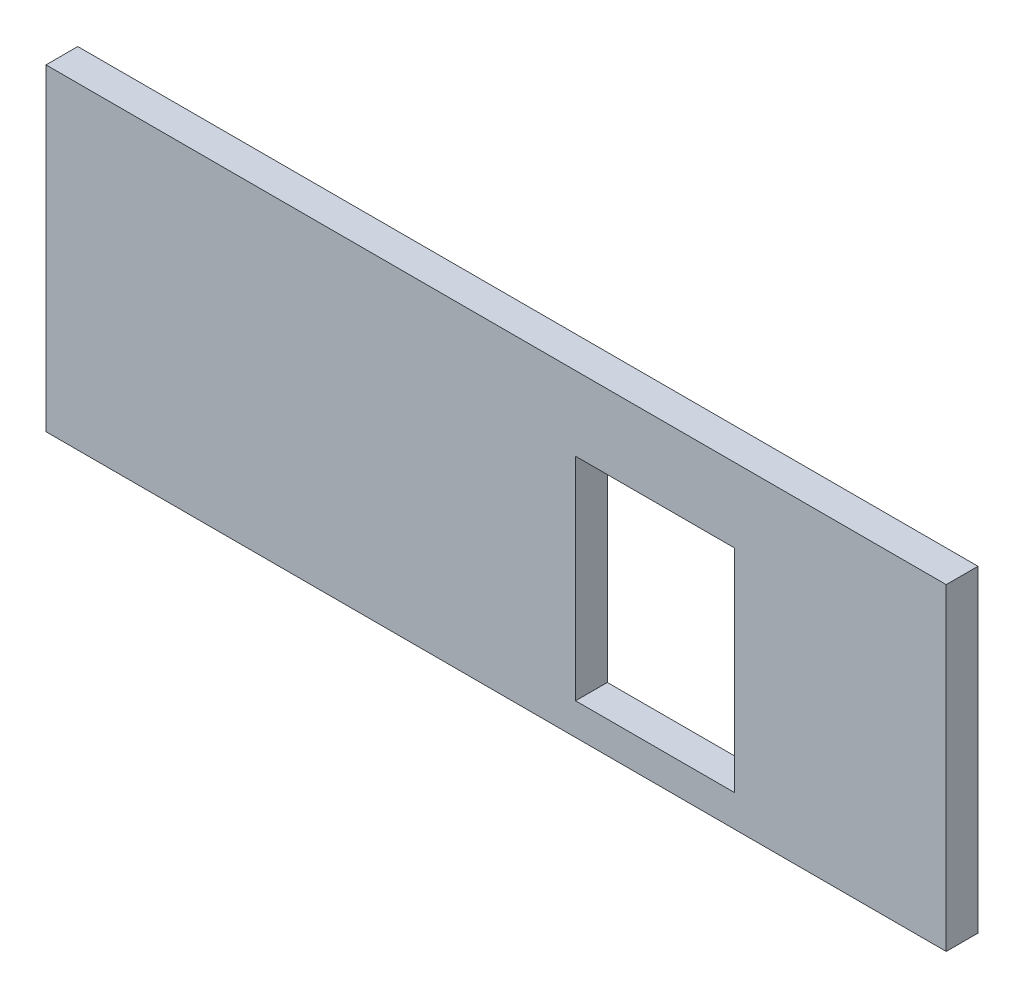
ISO-10303-21;
HEADER;
FILE_DESCRIPTION(('STEP AP214'),'2;1');
FILE_NAME('part.step','',(''),(''),'','','');
FILE_SCHEMA(('AUTOMOTIVE_DESIGN { 1 0 10303 214 1 1 1 1 }'));
ENDSEC;
DATA;
#1=APPLICATION_CONTEXT('core data for automotive mechanical design processes');
#2=APPLICATION_PROTOCOL_DEFINITION('international standard','automotive_design',2000,#1);
#3=PRODUCT_CONTEXT('',#1,'mechanical');
#4=PRODUCT('Part','Part','',(#3));
#5=PRODUCT_RELATED_PRODUCT_CATEGORY('part','',(#4));
#6=PRODUCT_DEFINITION_FORMATION('','',#4);
#7=PRODUCT_DEFINITION_CONTEXT('part definition',#1,'design');
#8=PRODUCT_DEFINITION('design','',#6,#7);
#9=PRODUCT_DEFINITION_SHAPE('','',#8);
#10=(LENGTH_UNIT() NAMED_UNIT(*) SI_UNIT(.MILLI.,.METRE.));
#11=(NAMED_UNIT(*) PLANE_ANGLE_UNIT() SI_UNIT($,.RADIAN.));
#12=(NAMED_UNIT(*) SI_UNIT($,.STERADIAN.) SOLID_ANGLE_UNIT());
#13=UNCERTAINTY_MEASURE_WITH_UNIT(LENGTH_MEASURE(1.E-05),#10,'distance_accuracy_value','');
#14=(GEOMETRIC_REPRESENTATION_CONTEXT(3) GLOBAL_UNCERTAINTY_ASSIGNED_CONTEXT((#13)) GLOBAL_UNIT_ASSIGNED_CONTEXT((#10,
#11,#12)) REPRESENTATION_CONTEXT('',''));
#15=CARTESIAN_POINT('',(0.,0.,0.));
#16=DIRECTION('',(0.,0.,1.));
#17=DIRECTION('',(1.,0.,0.));
#18=AXIS2_PLACEMENT_3D('',#15,#16,#17);
#19=CARTESIAN_POINT('',(0.,0.,6.));
#20=DIRECTION('',(1.,0.,0.));
#21=DIRECTION('',(0.,0.,-1.));
#22=AXIS2_PLACEMENT_3D('',#19,#20,#21);
#23=PLANE('',#22);
#24=DIRECTION('',(0.,-1.,0.));
#25=VECTOR('',#24,1.);
#26=CARTESIAN_POINT('',(0.,0.,0.));
#27=LINE('',#26,#25);
#28=CARTESIAN_POINT('',(0.,60.,0.));
#29=VERTEX_POINT('',#28);
#30=CARTESIAN_POINT('',(0.,0.,0.));
#31=VERTEX_POINT('',#30);
#32=EDGE_CURVE('E150',#29,#31,#27,.T.);
#33=ORIENTED_EDGE('',*,*,#32,.T.);
#34=DIRECTION('',(0.,0.,-1.));
#35=VECTOR('',#34,1.);
#36=CARTESIAN_POINT('',(0.,0.,6.));
#37=LINE('',#36,#35);
#38=CARTESIAN_POINT('',(0.,0.,6.));
#39=VERTEX_POINT('',#38);
#40=EDGE_CURVE('E11',#39,#31,#37,.T.);
#41=ORIENTED_EDGE('',*,*,#40,.F.);
#42=DIRECTION('',(0.,-1.,0.));
#43=VECTOR('',#42,1.);
#44=CARTESIAN_POINT('',(0.,0.,6.));
#45=LINE('',#44,#43);
#46=CARTESIAN_POINT('',(0.,60.,6.));
#47=VERTEX_POINT('',#46);
#48=EDGE_CURVE('E156',#47,#39,#45,.T.);
#49=ORIENTED_EDGE('',*,*,#48,.F.);
#50=DIRECTION('',(0.,0.,-1.));
#51=VECTOR('',#50,1.);
#52=CARTESIAN_POINT('',(0.,60.,6.));
#53=LINE('',#52,#51);
#54=EDGE_CURVE('E170',#47,#29,#53,.T.);
#55=ORIENTED_EDGE('',*,*,#54,.T.);
#56=EDGE_LOOP('',(#33,#41,#49,#55));
#57=FACE_BOUND('',#56,.T.);
#58=ADVANCED_FACE('F42',(#57),#23,.F.);
#59=CARTESIAN_POINT('',(0.,0.,6.));
#60=DIRECTION('',(0.,1.,0.));
#61=DIRECTION('',(0.,0.,1.));
#62=AXIS2_PLACEMENT_3D('',#59,#60,#61);
#63=PLANE('',#62);
#64=DIRECTION('',(1.,0.,0.));
#65=VECTOR('',#64,1.);
#66=CARTESIAN_POINT('',(0.,0.,0.));
#67=LINE('',#66,#65);
#68=CARTESIAN_POINT('',(170.,0.,0.));
#69=VERTEX_POINT('',#68);
#70=EDGE_CURVE('E174',#31,#69,#67,.T.);
#71=ORIENTED_EDGE('',*,*,#70,.T.);
#72=DIRECTION('',(0.,0.,-1.));
#73=VECTOR('',#72,1.);
#74=CARTESIAN_POINT('',(170.,0.,6.));
#75=LINE('',#74,#73);
#76=CARTESIAN_POINT('',(170.,0.,6.));
#77=VERTEX_POINT('',#76);
#78=EDGE_CURVE('E50',#77,#69,#75,.T.);
#79=ORIENTED_EDGE('',*,*,#78,.F.);
#80=DIRECTION('',(1.,0.,0.));
#81=VECTOR('',#80,1.);
#82=CARTESIAN_POINT('',(0.,0.,6.));
#83=LINE('',#82,#81);
#84=EDGE_CURVE('E160',#39,#77,#83,.T.);
#85=ORIENTED_EDGE('',*,*,#84,.F.);
#86=ORIENTED_EDGE('',*,*,#40,.T.);
#87=EDGE_LOOP('',(#71,#79,#85,#86));
#88=FACE_BOUND('',#87,.T.);
#89=ADVANCED_FACE('F208',(#88),#63,.F.);
#90=CARTESIAN_POINT('',(170.,0.,6.));
#91=DIRECTION('',(-1.,0.,0.));
#92=DIRECTION('',(0.,0.,1.));
#93=AXIS2_PLACEMENT_3D('',#90,#91,#92);
#94=PLANE('',#93);
#95=DIRECTION('',(0.,1.,0.));
#96=VECTOR('',#95,1.);
#97=CARTESIAN_POINT('',(170.,0.,0.));
#98=LINE('',#97,#96);
#99=CARTESIAN_POINT('',(170.,60.,0.));
#100=VERTEX_POINT('',#99);
#101=EDGE_CURVE('E177',#69,#100,#98,.T.);
#102=ORIENTED_EDGE('',*,*,#101,.T.);
#103=DIRECTION('',(0.,0.,-1.));
#104=VECTOR('',#103,1.);
#105=CARTESIAN_POINT('',(170.,60.,6.));
#106=LINE('',#105,#104);
#107=CARTESIAN_POINT('',(170.,60.,6.));
#108=VERTEX_POINT('',#107);
#109=EDGE_CURVE('E185',#108,#100,#106,.T.);
#110=ORIENTED_EDGE('',*,*,#109,.F.);
#111=DIRECTION('',(0.,1.,0.));
#112=VECTOR('',#111,1.);
#113=CARTESIAN_POINT('',(170.,0.,6.));
#114=LINE('',#113,#112);
#115=EDGE_CURVE('E164',#77,#108,#114,.T.);
#116=ORIENTED_EDGE('',*,*,#115,.F.);
#117=ORIENTED_EDGE('',*,*,#78,.T.);
#118=EDGE_LOOP('',(#102,#110,#116,#117));
#119=FACE_BOUND('',#118,.T.);
#120=ADVANCED_FACE('F194',(#119),#94,.F.);
#121=CARTESIAN_POINT('',(0.,60.,6.));
#122=DIRECTION('',(0.,-1.,0.));
#123=DIRECTION('',(0.,0.,-1.));
#124=AXIS2_PLACEMENT_3D('',#121,#122,#123);
#125=PLANE('',#124);
#126=DIRECTION('',(-1.,0.,0.));
#127=VECTOR('',#126,1.);
#128=CARTESIAN_POINT('',(0.,60.,0.));
#129=LINE('',#128,#127);
#130=EDGE_CURVE('E161',#100,#29,#129,.T.);
#131=ORIENTED_EDGE('',*,*,#130,.T.);
#132=ORIENTED_EDGE('',*,*,#54,.F.);
#133=DIRECTION('',(-1.,0.,0.));
#134=VECTOR('',#133,1.);
#135=CARTESIAN_POINT('',(0.,60.,6.));
#136=LINE('',#135,#134);
#137=EDGE_CURVE('E167',#108,#47,#136,.T.);
#138=ORIENTED_EDGE('',*,*,#137,.F.);
#139=ORIENTED_EDGE('',*,*,#109,.T.);
#140=EDGE_LOOP('',(#131,#132,#138,#139));
#141=FACE_BOUND('',#140,.T.);
#142=ADVANCED_FACE('F201',(#141),#125,.F.);
#143=CARTESIAN_POINT('',(0.,0.,6.));
#144=DIRECTION('',(0.,0.,-1.));
#145=DIRECTION('',(-1.,0.,0.));
#146=AXIS2_PLACEMENT_3D('',#143,#144,#145);
#147=PLANE('',#146);
#148=DIRECTION('',(1.,0.,0.));
#149=VECTOR('',#148,1.);
#150=CARTESIAN_POINT('',(100.,6.,6.));
#151=LINE('',#150,#149);
#152=CARTESIAN_POINT('',(100.,6.,6.));
#153=VERTEX_POINT('',#152);
#154=CARTESIAN_POINT('',(130.,6.,6.));
#155=VERTEX_POINT('',#154);
#156=EDGE_CURVE('E141',#153,#155,#151,.T.);
#157=ORIENTED_EDGE('',*,*,#156,.F.);
#158=DIRECTION('',(0.,-1.,0.));
#159=VECTOR('',#158,1.);
#160=CARTESIAN_POINT('',(100.,46.,6.));
#161=LINE('',#160,#159);
#162=CARTESIAN_POINT('',(100.,46.,6.));
#163=VERTEX_POINT('',#162);
#164=EDGE_CURVE('E57',#163,#153,#161,.T.);
#165=ORIENTED_EDGE('',*,*,#164,.F.);
#166=DIRECTION('',(-1.,0.,0.));
#167=VECTOR('',#166,1.);
#168=CARTESIAN_POINT('',(100.,46.,6.));
#169=LINE('',#168,#167);
#170=CARTESIAN_POINT('',(130.,46.,6.));
#171=VERTEX_POINT('',#170);
#172=EDGE_CURVE('E128',#171,#163,#169,.T.);
#173=ORIENTED_EDGE('',*,*,#172,.F.);
#174=DIRECTION('',(0.,1.,0.));
#175=VECTOR('',#174,1.);
#176=CARTESIAN_POINT('',(130.,46.,6.));
#177=LINE('',#176,#175);
#178=EDGE_CURVE('E132',#155,#171,#177,.T.);
#179=ORIENTED_EDGE('',*,*,#178,.F.);
#180=EDGE_LOOP('',(#157,#165,#173,#179));
#181=FACE_BOUND('',#180,.T.);
#182=ORIENTED_EDGE('',*,*,#48,.T.);
#183=ORIENTED_EDGE('',*,*,#84,.T.);
#184=ORIENTED_EDGE('',*,*,#115,.T.);
#185=ORIENTED_EDGE('',*,*,#137,.T.);
#186=EDGE_LOOP('',(#182,#183,#184,#185));
#187=FACE_BOUND('',#186,.T.);
#188=ADVANCED_FACE('F207',(#181,#187),#147,.F.);
#189=CARTESIAN_POINT('',(0.,0.,0.));
#190=DIRECTION('',(0.,0.,-1.));
#191=DIRECTION('',(-1.,0.,0.));
#192=AXIS2_PLACEMENT_3D('',#189,#190,#191);
#193=PLANE('',#192);
#194=DIRECTION('',(0.,-1.,0.));
#195=VECTOR('',#194,1.);
#196=CARTESIAN_POINT('',(100.,46.,0.));
#197=LINE('',#196,#195);
#198=CARTESIAN_POINT('',(100.,46.,0.));
#199=VERTEX_POINT('',#198);
#200=CARTESIAN_POINT('',(100.,6.,0.));
#201=VERTEX_POINT('',#200);
#202=EDGE_CURVE('E109',#199,#201,#197,.T.);
#203=ORIENTED_EDGE('',*,*,#202,.T.);
#204=DIRECTION('',(1.,0.,0.));
#205=VECTOR('',#204,1.);
#206=CARTESIAN_POINT('',(100.,6.,0.));
#207=LINE('',#206,#205);
#208=CARTESIAN_POINT('',(130.,6.,0.));
#209=VERTEX_POINT('',#208);
#210=EDGE_CURVE('E119',#201,#209,#207,.T.);
#211=ORIENTED_EDGE('',*,*,#210,.T.);
#212=DIRECTION('',(0.,1.,0.));
#213=VECTOR('',#212,1.);
#214=CARTESIAN_POINT('',(130.,46.,0.));
#215=LINE('',#214,#213);
#216=CARTESIAN_POINT('',(130.,46.,0.));
#217=VERTEX_POINT('',#216);
#218=EDGE_CURVE('E65',#209,#217,#215,.T.);
#219=ORIENTED_EDGE('',*,*,#218,.T.);
#220=DIRECTION('',(-1.,0.,0.));
#221=VECTOR('',#220,1.);
#222=CARTESIAN_POINT('',(100.,46.,0.));
#223=LINE('',#222,#221);
#224=EDGE_CURVE('E116',#217,#199,#223,.T.);
#225=ORIENTED_EDGE('',*,*,#224,.T.);
#226=EDGE_LOOP('',(#203,#211,#219,#225));
#227=FACE_BOUND('',#226,.T.);
#228=ORIENTED_EDGE('',*,*,#32,.F.);
#229=ORIENTED_EDGE('',*,*,#130,.F.);
#230=ORIENTED_EDGE('',*,*,#101,.F.);
#231=ORIENTED_EDGE('',*,*,#70,.F.);
#232=EDGE_LOOP('',(#228,#229,#230,#231));
#233=FACE_BOUND('',#232,.T.);
#234=ADVANCED_FACE('F124',(#227,#233),#193,.T.);
#235=CARTESIAN_POINT('',(100.,46.,0.));
#236=DIRECTION('',(-1.,0.,0.));
#237=DIRECTION('',(0.,0.,1.));
#238=AXIS2_PLACEMENT_3D('',#235,#236,#237);
#239=PLANE('',#238);
#240=ORIENTED_EDGE('',*,*,#164,.T.);
#241=DIRECTION('',(0.,0.,1.));
#242=VECTOR('',#241,1.);
#243=CARTESIAN_POINT('',(100.,6.,0.));
#244=LINE('',#243,#242);
#245=EDGE_CURVE('E105',#201,#153,#244,.T.);
#246=ORIENTED_EDGE('',*,*,#245,.F.);
#247=ORIENTED_EDGE('',*,*,#202,.F.);
#248=DIRECTION('',(0.,0.,1.));
#249=VECTOR('',#248,1.);
#250=CARTESIAN_POINT('',(100.,46.,0.));
#251=LINE('',#250,#249);
#252=EDGE_CURVE('E147',#199,#163,#251,.T.);
#253=ORIENTED_EDGE('',*,*,#252,.T.);
#254=EDGE_LOOP('',(#240,#246,#247,#253));
#255=FACE_BOUND('',#254,.T.);
#256=ADVANCED_FACE('F107',(#255),#239,.F.);
#257=CARTESIAN_POINT('',(100.,46.,0.));
#258=DIRECTION('',(0.,1.,0.));
#259=DIRECTION('',(0.,0.,1.));
#260=AXIS2_PLACEMENT_3D('',#257,#258,#259);
#261=PLANE('',#260);
#262=ORIENTED_EDGE('',*,*,#172,.T.);
#263=ORIENTED_EDGE('',*,*,#252,.F.);
#264=ORIENTED_EDGE('',*,*,#224,.F.);
#265=DIRECTION('',(0.,0.,1.));
#266=VECTOR('',#265,1.);
#267=CARTESIAN_POINT('',(130.,46.,0.));
#268=LINE('',#267,#266);
#269=EDGE_CURVE('E151',#217,#171,#268,.T.);
#270=ORIENTED_EDGE('',*,*,#269,.T.);
#271=EDGE_LOOP('',(#262,#263,#264,#270));
#272=FACE_BOUND('',#271,.T.);
#273=ADVANCED_FACE('F225',(#272),#261,.F.);
#274=CARTESIAN_POINT('',(130.,46.,0.));
#275=DIRECTION('',(1.,0.,0.));
#276=DIRECTION('',(0.,0.,-1.));
#277=AXIS2_PLACEMENT_3D('',#274,#275,#276);
#278=PLANE('',#277);
#279=ORIENTED_EDGE('',*,*,#178,.T.);
#280=ORIENTED_EDGE('',*,*,#269,.F.);
#281=ORIENTED_EDGE('',*,*,#218,.F.);
#282=DIRECTION('',(0.,0.,1.));
#283=VECTOR('',#282,1.);
#284=CARTESIAN_POINT('',(130.,6.,0.));
#285=LINE('',#284,#283);
#286=EDGE_CURVE('E115',#209,#155,#285,.T.);
#287=ORIENTED_EDGE('',*,*,#286,.T.);
#288=EDGE_LOOP('',(#279,#280,#281,#287));
#289=FACE_BOUND('',#288,.T.);
#290=ADVANCED_FACE('F228',(#289),#278,.F.);
#291=CARTESIAN_POINT('',(100.,6.,0.));
#292=DIRECTION('',(0.,-1.,0.));
#293=DIRECTION('',(0.,0.,-1.));
#294=AXIS2_PLACEMENT_3D('',#291,#292,#293);
#295=PLANE('',#294);
#296=ORIENTED_EDGE('',*,*,#156,.T.);
#297=ORIENTED_EDGE('',*,*,#286,.F.);
#298=ORIENTED_EDGE('',*,*,#210,.F.);
#299=ORIENTED_EDGE('',*,*,#245,.T.);
#300=EDGE_LOOP('',(#296,#297,#298,#299));
#301=FACE_BOUND('',#300,.T.);
#302=ADVANCED_FACE('F120',(#301),#295,.F.);
#303=CLOSED_SHELL('',(#58,#89,#120,#142,#188,#234,#256,#273,#290,#302));
#304=MANIFOLD_SOLID_BREP('B2',#303);
#305=ADVANCED_BREP_SHAPE_REPRESENTATION('',(#18,#304),#14);
#306=SHAPE_DEFINITION_REPRESENTATION(#9,#305);
ENDSEC;
END-ISO-10303-21;
